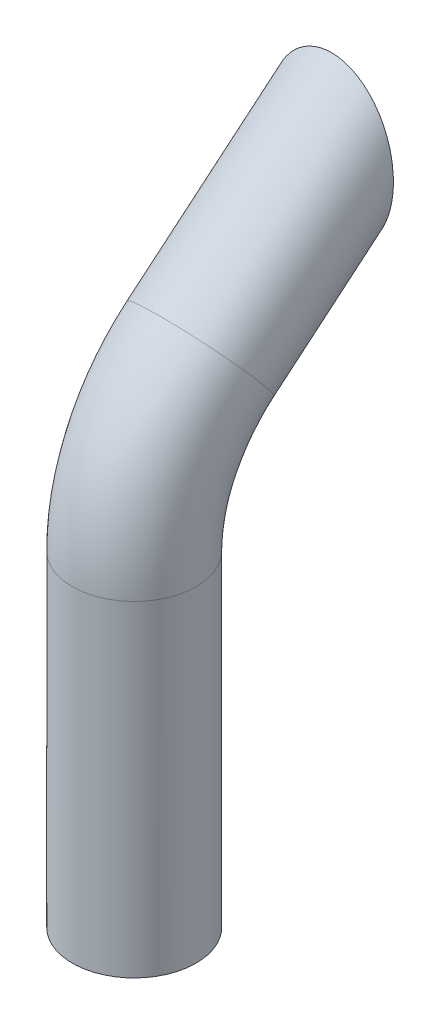
ISO-10303-21;
HEADER;
FILE_DESCRIPTION(('STEP AP214'),'2;1');
FILE_NAME('part.step','',(''),(''),'','','');
FILE_SCHEMA(('AUTOMOTIVE_DESIGN { 1 0 10303 214 1 1 1 1 }'));
ENDSEC;
DATA;
#1=APPLICATION_CONTEXT('core data for automotive mechanical design processes');
#2=APPLICATION_PROTOCOL_DEFINITION('international standard','automotive_design',2000,#1);
#3=PRODUCT_CONTEXT('',#1,'mechanical');
#4=PRODUCT('Part','Part','',(#3));
#5=PRODUCT_RELATED_PRODUCT_CATEGORY('part','',(#4));
#6=PRODUCT_DEFINITION_FORMATION('','',#4);
#7=PRODUCT_DEFINITION_CONTEXT('part definition',#1,'design');
#8=PRODUCT_DEFINITION('design','',#6,#7);
#9=PRODUCT_DEFINITION_SHAPE('','',#8);
#10=(LENGTH_UNIT() NAMED_UNIT(*) SI_UNIT(.MILLI.,.METRE.));
#11=(NAMED_UNIT(*) PLANE_ANGLE_UNIT() SI_UNIT($,.RADIAN.));
#12=(NAMED_UNIT(*) SI_UNIT($,.STERADIAN.) SOLID_ANGLE_UNIT());
#13=UNCERTAINTY_MEASURE_WITH_UNIT(LENGTH_MEASURE(1.E-05),#10,'distance_accuracy_value','');
#14=(GEOMETRIC_REPRESENTATION_CONTEXT(3) GLOBAL_UNCERTAINTY_ASSIGNED_CONTEXT((#13)) GLOBAL_UNIT_ASSIGNED_CONTEXT((#10,
#11,#12)) REPRESENTATION_CONTEXT('',''));
#15=CARTESIAN_POINT('',(0.,0.,0.));
#16=DIRECTION('',(0.,0.,1.));
#17=DIRECTION('',(1.,0.,0.));
#18=AXIS2_PLACEMENT_3D('',#15,#16,#17);
#19=CARTESIAN_POINT('',(0.,-296.418141452981,114.906666467847));
#20=DIRECTION('',(0.,-1.,0.));
#21=DIRECTION('',(0.,0.,-1.));
#22=AXIS2_PLACEMENT_3D('',#19,#20,#21);
#23=PLANE('',#22);
#24=CARTESIAN_POINT('',(0.,-296.418141452981,114.906666467847));
#25=DIRECTION('',(0.,-1.,0.));
#26=DIRECTION('',(0.,0.,-1.));
#27=AXIS2_PLACEMENT_3D('',#24,#25,#26);
#28=CIRCLE('',#27,27.);
#29=CARTESIAN_POINT('',(0.,-296.418141452981,87.9066664678468));
#30=VERTEX_POINT('',#29);
#31=EDGE_CURVE('E60',#30,#30,#28,.T.);
#32=ORIENTED_EDGE('',*,*,#31,.F.);
#33=EDGE_LOOP('',(#32));
#34=FACE_BOUND('',#33,.T.);
#35=CARTESIAN_POINT('',(0.,-296.418141452981,114.906666467847));
#36=DIRECTION('',(0.,-1.,0.));
#37=DIRECTION('',(0.,0.,-1.));
#38=AXIS2_PLACEMENT_3D('',#35,#36,#37);
#39=CIRCLE('',#38,30.);
#40=CARTESIAN_POINT('',(0.,-296.418141452981,84.9066664678468));
#41=VERTEX_POINT('',#40);
#42=EDGE_CURVE('E10',#41,#41,#39,.T.);
#43=ORIENTED_EDGE('',*,*,#42,.T.);
#44=EDGE_LOOP('',(#43));
#45=FACE_BOUND('',#44,.T.);
#46=ADVANCED_FACE('F41',(#34,#45),#23,.T.);
#47=CARTESIAN_POINT('',(0.,0.,0.));
#48=DIRECTION('',(0.,-0.642787609686538,0.766044443118979));
#49=DIRECTION('',(0.,-0.766044443118979,-0.642787609686538));
#50=AXIS2_PLACEMENT_3D('',#47,#48,#49);
#51=CYLINDRICAL_SURFACE('',#50,30.);
#52=CARTESIAN_POINT('',(0.,-16.1808853863989,19.2836282905961));
#53=DIRECTION('',(0.,0.,1.));
#54=DIRECTION('',(0.,-1.,0.));
#55=AXIS2_PLACEMENT_3D('',#52,#53,#54);
#56=ELLIPSE('',#55,39.1622186799683,30.);
#57=CARTESIAN_POINT('',(0.,-55.3431040663672,19.2836282905961));
#58=VERTEX_POINT('',#57);
#59=EDGE_CURVE('E72',#58,#58,#56,.F.);
#60=ORIENTED_EDGE('',*,*,#59,.F.);
#61=EDGE_LOOP('',(#60));
#62=FACE_BOUND('',#61,.T.);
#63=CARTESIAN_POINT('',(0.,-69.4418308062222,82.7575513396349));
#64=DIRECTION('',(0.,-0.642787609686538,0.766044443118979));
#65=DIRECTION('',(0.,-0.766044443118979,-0.642787609686538));
#66=AXIS2_PLACEMENT_3D('',#63,#64,#65);
#67=CIRCLE('',#66,30.);
#68=CARTESIAN_POINT('',(0.,-46.4604975126528,102.041179630231));
#69=VERTEX_POINT('',#68);
#70=EDGE_CURVE('E54',#69,#69,#67,.T.);
#71=ORIENTED_EDGE('',*,*,#70,.F.);
#72=EDGE_LOOP('',(#71));
#73=FACE_BOUND('',#72,.T.);
#74=ADVANCED_FACE('F103',(#62,#73),#51,.T.);
#75=CARTESIAN_POINT('',(0.,-138.385830686931,24.9066664678469));
#76=DIRECTION('',(1.,0.,0.));
#77=DIRECTION('',(0.,0.,-1.));
#78=AXIS2_PLACEMENT_3D('',#75,#76,#77);
#79=TOROIDAL_SURFACE('',#78,90.,30.);
#80=CARTESIAN_POINT('',(0.,-138.385830686931,114.906666467847));
#81=DIRECTION('',(0.,-1.,0.));
#82=DIRECTION('',(0.,0.,-1.));
#83=AXIS2_PLACEMENT_3D('',#80,#81,#82);
#84=CIRCLE('',#83,30.);
#85=CARTESIAN_POINT('',(0.,-138.385830686931,144.906666467847));
#86=VERTEX_POINT('',#85);
#87=EDGE_CURVE('E49',#86,#86,#84,.T.);
#88=CARTESIAN_POINT('',(0.,-138.385830686931,24.9066664678469));
#89=DIRECTION('',(1.,0.,0.));
#90=DIRECTION('',(0.,0.,-1.));
#91=AXIS2_PLACEMENT_3D('',#88,#89,#90);
#92=CIRCLE('',#91,120.);
#93=EDGE_CURVE('',#69,#86,#92,.T.);
#94=ORIENTED_EDGE('',*,*,#70,.T.);
#95=ORIENTED_EDGE('',*,*,#87,.F.);
#96=ORIENTED_EDGE('',*,*,#93,.T.);
#97=ORIENTED_EDGE('',*,*,#93,.F.);
#98=EDGE_LOOP('',(#94,#96,#95,#97));
#99=FACE_BOUND('',#98,.T.);
#100=ADVANCED_FACE('F98',(#99),#79,.T.);
#101=CARTESIAN_POINT('',(0.,-138.385830686931,114.906666467847));
#102=DIRECTION('',(0.,-1.,0.));
#103=DIRECTION('',(0.,0.,-1.));
#104=AXIS2_PLACEMENT_3D('',#101,#102,#103);
#105=CYLINDRICAL_SURFACE('',#104,30.);
#106=ORIENTED_EDGE('',*,*,#42,.F.);
#107=EDGE_LOOP('',(#106));
#108=FACE_BOUND('',#107,.T.);
#109=ORIENTED_EDGE('',*,*,#87,.T.);
#110=EDGE_LOOP('',(#109));
#111=FACE_BOUND('',#110,.T.);
#112=ADVANCED_FACE('F96',(#108,#111),#105,.T.);
#113=CARTESIAN_POINT('',(0.,0.,0.));
#114=DIRECTION('',(0.,-0.642787609686538,0.766044443118979));
#115=DIRECTION('',(0.,-0.766044443118979,-0.642787609686538));
#116=AXIS2_PLACEMENT_3D('',#113,#114,#115);
#117=CYLINDRICAL_SURFACE('',#116,27.);
#118=CARTESIAN_POINT('',(0.,-16.1808853863989,19.2836282905961));
#119=DIRECTION('',(0.,0.,1.));
#120=DIRECTION('',(0.,-1.,0.));
#121=AXIS2_PLACEMENT_3D('',#118,#119,#120);
#122=ELLIPSE('',#121,35.2459968119715,27.);
#123=CARTESIAN_POINT('',(0.,-51.4268821983704,19.2836282905961));
#124=VERTEX_POINT('',#123);
#125=EDGE_CURVE('E44',#124,#124,#122,.F.);
#126=ORIENTED_EDGE('',*,*,#125,.T.);
#127=EDGE_LOOP('',(#126));
#128=FACE_BOUND('',#127,.T.);
#129=CARTESIAN_POINT('',(0.,-69.4418308062223,82.757551339635));
#130=DIRECTION('',(0.,0.642787609686535,-0.766044443118982));
#131=DIRECTION('',(0.,0.766044443118982,0.642787609686535));
#132=AXIS2_PLACEMENT_3D('',#129,#130,#131);
#133=CIRCLE('',#132,27.);
#134=CARTESIAN_POINT('',(0.,-48.7586308420098,100.112816801171));
#135=VERTEX_POINT('',#134);
#136=EDGE_CURVE('E68',#135,#135,#133,.F.);
#137=ORIENTED_EDGE('',*,*,#136,.T.);
#138=EDGE_LOOP('',(#137));
#139=FACE_BOUND('',#138,.T.);
#140=ADVANCED_FACE('F81',(#128,#139),#117,.F.);
#141=CARTESIAN_POINT('',(0.,-138.385830686931,24.9066664678469));
#142=DIRECTION('',(1.,0.,0.));
#143=DIRECTION('',(0.,0.,-1.));
#144=AXIS2_PLACEMENT_3D('',#141,#142,#143);
#145=TOROIDAL_SURFACE('',#144,90.,27.);
#146=CARTESIAN_POINT('',(0.,-138.385830686931,114.906666467847));
#147=DIRECTION('',(0.,-1.,0.));
#148=DIRECTION('',(0.,0.,-1.));
#149=AXIS2_PLACEMENT_3D('',#146,#147,#148);
#150=CIRCLE('',#149,27.);
#151=CARTESIAN_POINT('',(0.,-138.385830686931,141.906666467847));
#152=VERTEX_POINT('',#151);
#153=EDGE_CURVE('E64',#152,#152,#150,.T.);
#154=CARTESIAN_POINT('',(0.,-138.385830686931,24.9066664678469));
#155=DIRECTION('',(1.,0.,0.));
#156=DIRECTION('',(0.,0.,-1.));
#157=AXIS2_PLACEMENT_3D('',#154,#155,#156);
#158=CIRCLE('',#157,117.);
#159=EDGE_CURVE('',#135,#152,#158,.T.);
#160=ORIENTED_EDGE('',*,*,#136,.F.);
#161=ORIENTED_EDGE('',*,*,#153,.T.);
#162=ORIENTED_EDGE('',*,*,#159,.T.);
#163=ORIENTED_EDGE('',*,*,#159,.F.);
#164=EDGE_LOOP('',(#160,#162,#161,#163));
#165=FACE_BOUND('',#164,.T.);
#166=ADVANCED_FACE('F91',(#165),#145,.F.);
#167=CARTESIAN_POINT('',(0.,-138.385830686931,114.906666467847));
#168=DIRECTION('',(0.,-1.,0.));
#169=DIRECTION('',(0.,0.,-1.));
#170=AXIS2_PLACEMENT_3D('',#167,#168,#169);
#171=CYLINDRICAL_SURFACE('',#170,27.);
#172=ORIENTED_EDGE('',*,*,#31,.T.);
#173=EDGE_LOOP('',(#172));
#174=FACE_BOUND('',#173,.T.);
#175=ORIENTED_EDGE('',*,*,#153,.F.);
#176=EDGE_LOOP('',(#175));
#177=FACE_BOUND('',#176,.T.);
#178=ADVANCED_FACE('F86',(#174,#177),#171,.F.);
#179=CARTESIAN_POINT('',(-45.,-68.9439998807081,19.2836282905961));
#180=DIRECTION('',(0.,0.,1.));
#181=DIRECTION('',(1.,0.,0.));
#182=AXIS2_PLACEMENT_3D('',#179,#180,#181);
#183=PLANE('',#182);
#184=ORIENTED_EDGE('',*,*,#59,.T.);
#185=EDGE_LOOP('',(#184));
#186=FACE_BOUND('',#185,.T.);
#187=ORIENTED_EDGE('',*,*,#125,.F.);
#188=EDGE_LOOP('',(#187));
#189=FACE_BOUND('',#188,.T.);
#190=ADVANCED_FACE('F84',(#186,#189),#183,.F.);
#191=CLOSED_SHELL('',(#46,#74,#100,#112,#140,#166,#178,#190));
#192=MANIFOLD_SOLID_BREP('B2',#191);
#193=ADVANCED_BREP_SHAPE_REPRESENTATION('',(#18,#192),#14);
#194=SHAPE_DEFINITION_REPRESENTATION(#9,#193);
ENDSEC;
END-ISO-10303-21;
